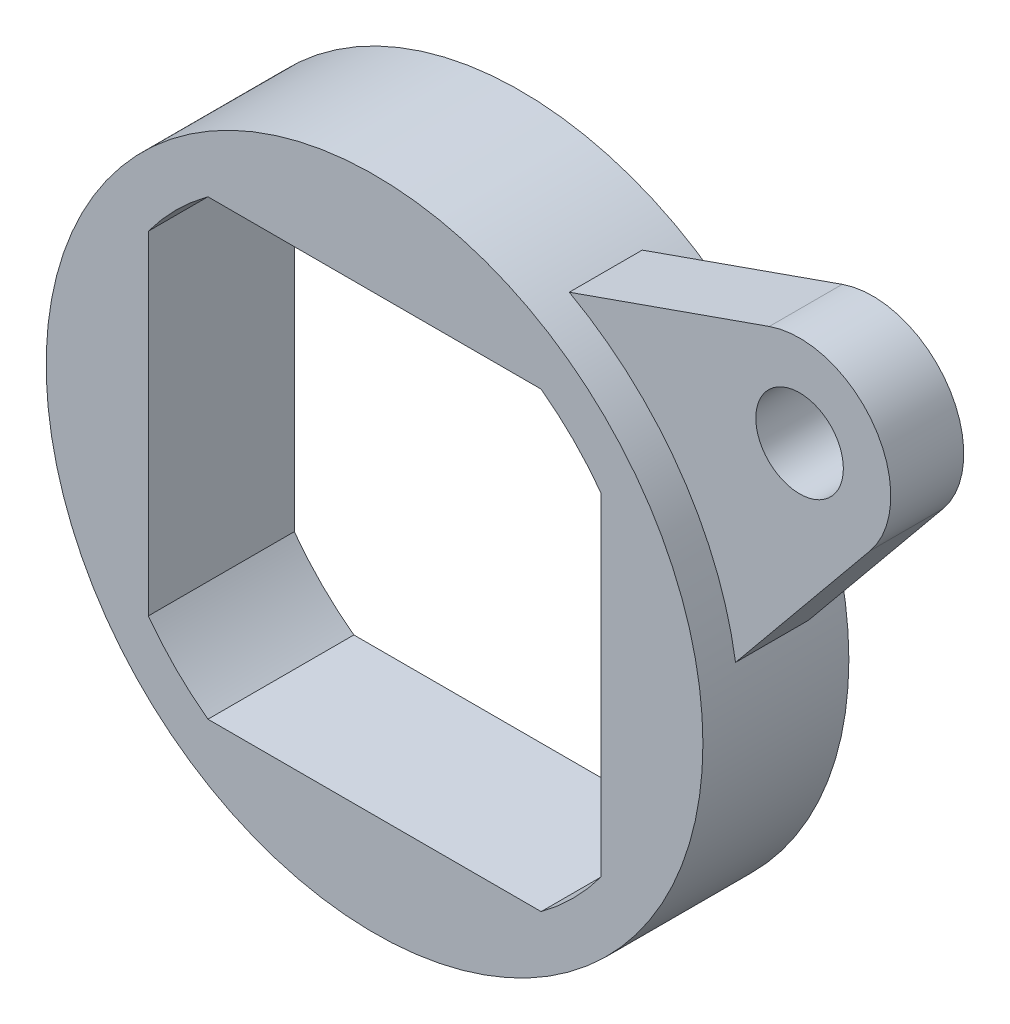
ISO-10303-21;
HEADER;
FILE_DESCRIPTION(('STEP AP214'),'2;1');
FILE_NAME('part.step','',(''),(''),'','','');
FILE_SCHEMA(('AUTOMOTIVE_DESIGN { 1 0 10303 214 1 1 1 1 }'));
ENDSEC;
DATA;
#1=APPLICATION_CONTEXT('core data for automotive mechanical design processes');
#2=APPLICATION_PROTOCOL_DEFINITION('international standard','automotive_design',2000,#1);
#3=PRODUCT_CONTEXT('',#1,'mechanical');
#4=PRODUCT('Part','Part','',(#3));
#5=PRODUCT_RELATED_PRODUCT_CATEGORY('part','',(#4));
#6=PRODUCT_DEFINITION_FORMATION('','',#4);
#7=PRODUCT_DEFINITION_CONTEXT('part definition',#1,'design');
#8=PRODUCT_DEFINITION('design','',#6,#7);
#9=PRODUCT_DEFINITION_SHAPE('','',#8);
#10=(LENGTH_UNIT() NAMED_UNIT(*) SI_UNIT(.MILLI.,.METRE.));
#11=(NAMED_UNIT(*) PLANE_ANGLE_UNIT() SI_UNIT($,.RADIAN.));
#12=(NAMED_UNIT(*) SI_UNIT($,.STERADIAN.) SOLID_ANGLE_UNIT());
#13=UNCERTAINTY_MEASURE_WITH_UNIT(LENGTH_MEASURE(1.E-05),#10,'distance_accuracy_value','');
#14=(GEOMETRIC_REPRESENTATION_CONTEXT(3) GLOBAL_UNCERTAINTY_ASSIGNED_CONTEXT((#13)) GLOBAL_UNIT_ASSIGNED_CONTEXT((#10,
#11,#12)) REPRESENTATION_CONTEXT('',''));
#15=CARTESIAN_POINT('',(0.,0.,0.));
#16=DIRECTION('',(0.,0.,1.));
#17=DIRECTION('',(1.,0.,0.));
#18=AXIS2_PLACEMENT_3D('',#15,#16,#17);
#19=CARTESIAN_POINT('',(0.,0.,24.9));
#20=DIRECTION('',(0.,0.,-1.));
#21=DIRECTION('',(-1.,0.,0.));
#22=AXIS2_PLACEMENT_3D('',#19,#20,#21);
#23=CYLINDRICAL_SURFACE('',#22,9.);
#24=DIRECTION('',(0.,0.,-1.));
#25=VECTOR('',#24,1.);
#26=CARTESIAN_POINT('',(8.8938586878365,1.37814282307574,23.9));
#27=LINE('',#26,#25);
#28=CARTESIAN_POINT('',(8.8938586878365,1.37814282307574,23.9));
#29=VERTEX_POINT('',#28);
#30=CARTESIAN_POINT('',(8.8938586878365,1.37814282307574,21.9));
#31=VERTEX_POINT('',#30);
#32=EDGE_CURVE('E58',#29,#31,#27,.T.);
#33=ORIENTED_EDGE('',*,*,#32,.F.);
#34=CARTESIAN_POINT('',(0.,0.,23.9));
#35=DIRECTION('',(0.,0.,1.));
#36=DIRECTION('',(1.,0.,0.));
#37=AXIS2_PLACEMENT_3D('',#34,#35,#36);
#38=CIRCLE('',#37,9.);
#39=CARTESIAN_POINT('',(4.33690946436556,7.88614077340092,23.9));
#40=VERTEX_POINT('',#39);
#41=EDGE_CURVE('E53',#29,#40,#38,.T.);
#42=ORIENTED_EDGE('',*,*,#41,.T.);
#43=DIRECTION('',(0.,0.,-1.));
#44=VECTOR('',#43,1.);
#45=CARTESIAN_POINT('',(4.33690946436556,7.88614077340092,23.9));
#46=LINE('',#45,#44);
#47=CARTESIAN_POINT('',(4.33690946436556,7.88614077340092,21.9));
#48=VERTEX_POINT('',#47);
#49=EDGE_CURVE('E132',#40,#48,#46,.T.);
#50=ORIENTED_EDGE('',*,*,#49,.T.);
#51=CARTESIAN_POINT('',(0.,0.,21.9));
#52=DIRECTION('',(0.,0.,1.));
#53=DIRECTION('',(1.,0.,0.));
#54=AXIS2_PLACEMENT_3D('',#51,#52,#53);
#55=CIRCLE('',#54,9.);
#56=EDGE_CURVE('E497',#31,#48,#55,.T.);
#57=ORIENTED_EDGE('',*,*,#56,.F.);
#58=EDGE_LOOP('',(#33,#42,#50,#57));
#59=FACE_BOUND('',#58,.T.);
#60=CARTESIAN_POINT('',(0.,0.,24.9));
#61=DIRECTION('',(0.,0.,1.));
#62=DIRECTION('',(1.,0.,0.));
#63=AXIS2_PLACEMENT_3D('',#60,#61,#62);
#64=CIRCLE('',#63,9.);
#65=CARTESIAN_POINT('',(9.,0.,24.9));
#66=VERTEX_POINT('',#65);
#67=EDGE_CURVE('E11',#66,#66,#64,.T.);
#68=ORIENTED_EDGE('',*,*,#67,.F.);
#69=EDGE_LOOP('',(#68));
#70=FACE_BOUND('',#69,.T.);
#71=CARTESIAN_POINT('',(0.,0.,20.9));
#72=DIRECTION('',(0.,0.,1.));
#73=DIRECTION('',(1.,0.,0.));
#74=AXIS2_PLACEMENT_3D('',#71,#72,#73);
#75=CIRCLE('',#74,9.);
#76=CARTESIAN_POINT('',(9.,0.,20.9));
#77=VERTEX_POINT('',#76);
#78=EDGE_CURVE('E42',#77,#77,#75,.T.);
#79=ORIENTED_EDGE('',*,*,#78,.T.);
#80=EDGE_LOOP('',(#79));
#81=FACE_BOUND('',#80,.T.);
#82=ADVANCED_FACE('F39',(#59,#70,#81),#23,.T.);
#83=CARTESIAN_POINT('',(0.,0.,24.9));
#84=DIRECTION('',(0.,0.,1.));
#85=DIRECTION('',(1.,0.,0.));
#86=AXIS2_PLACEMENT_3D('',#83,#84,#85);
#87=PLANE('',#86);
#88=DIRECTION('',(0.,1.,0.));
#89=VECTOR('',#88,1.);
#90=CARTESIAN_POINT('',(-6.2,-15.,24.9));
#91=LINE('',#90,#89);
#92=CARTESIAN_POINT('',(-6.2,-4.56618002273235,24.9));
#93=VERTEX_POINT('',#92);
#94=CARTESIAN_POINT('',(-6.2,4.56618002273235,24.9));
#95=VERTEX_POINT('',#94);
#96=EDGE_CURVE('E154',#93,#95,#91,.T.);
#97=ORIENTED_EDGE('',*,*,#96,.T.);
#98=CARTESIAN_POINT('',(0.,0.,24.9));
#99=DIRECTION('',(0.,0.,1.));
#100=DIRECTION('',(1.,0.,0.));
#101=AXIS2_PLACEMENT_3D('',#98,#99,#100);
#102=CIRCLE('',#101,7.7);
#103=CARTESIAN_POINT('',(-4.56618002273235,6.2,24.9));
#104=VERTEX_POINT('',#103);
#105=EDGE_CURVE('E157',#104,#95,#102,.T.);
#106=ORIENTED_EDGE('',*,*,#105,.F.);
#107=DIRECTION('',(-1.,0.,0.));
#108=VECTOR('',#107,1.);
#109=CARTESIAN_POINT('',(-11.07277942026,6.2,24.9));
#110=LINE('',#109,#108);
#111=CARTESIAN_POINT('',(4.56618002273235,6.2,24.9));
#112=VERTEX_POINT('',#111);
#113=EDGE_CURVE('E160',#112,#104,#110,.T.);
#114=ORIENTED_EDGE('',*,*,#113,.F.);
#115=CARTESIAN_POINT('',(0.,0.,24.9));
#116=DIRECTION('',(0.,0.,1.));
#117=DIRECTION('',(1.,0.,0.));
#118=AXIS2_PLACEMENT_3D('',#115,#116,#117);
#119=CIRCLE('',#118,7.7);
#120=CARTESIAN_POINT('',(6.2,4.56618002273235,24.9));
#121=VERTEX_POINT('',#120);
#122=EDGE_CURVE('E163',#121,#112,#119,.T.);
#123=ORIENTED_EDGE('',*,*,#122,.F.);
#124=DIRECTION('',(0.,1.,0.));
#125=VECTOR('',#124,1.);
#126=CARTESIAN_POINT('',(6.2,-15.,24.9));
#127=LINE('',#126,#125);
#128=CARTESIAN_POINT('',(6.2,-4.56618002273235,24.9));
#129=VERTEX_POINT('',#128);
#130=EDGE_CURVE('E165',#129,#121,#127,.T.);
#131=ORIENTED_EDGE('',*,*,#130,.F.);
#132=CARTESIAN_POINT('',(0.,0.,24.9));
#133=DIRECTION('',(0.,0.,1.));
#134=DIRECTION('',(1.,0.,0.));
#135=AXIS2_PLACEMENT_3D('',#132,#133,#134);
#136=CIRCLE('',#135,7.7);
#137=CARTESIAN_POINT('',(4.56618002273235,-6.2,24.9));
#138=VERTEX_POINT('',#137);
#139=EDGE_CURVE('E167',#138,#129,#136,.T.);
#140=ORIENTED_EDGE('',*,*,#139,.F.);
#141=DIRECTION('',(-1.,0.,0.));
#142=VECTOR('',#141,1.);
#143=CARTESIAN_POINT('',(-11.07277942026,-6.2,24.9));
#144=LINE('',#143,#142);
#145=CARTESIAN_POINT('',(-4.56618002273236,-6.2,24.9));
#146=VERTEX_POINT('',#145);
#147=EDGE_CURVE('E169',#138,#146,#144,.T.);
#148=ORIENTED_EDGE('',*,*,#147,.T.);
#149=CARTESIAN_POINT('',(0.,0.,24.9));
#150=DIRECTION('',(0.,0.,1.));
#151=DIRECTION('',(1.,0.,0.));
#152=AXIS2_PLACEMENT_3D('',#149,#150,#151);
#153=CIRCLE('',#152,7.7);
#154=EDGE_CURVE('E172',#93,#146,#153,.T.);
#155=ORIENTED_EDGE('',*,*,#154,.F.);
#156=EDGE_LOOP('',(#97,#106,#114,#123,#131,#140,#148,#155));
#157=FACE_BOUND('',#156,.T.);
#158=ORIENTED_EDGE('',*,*,#67,.T.);
#159=EDGE_LOOP('',(#158));
#160=FACE_BOUND('',#159,.T.);
#161=ADVANCED_FACE('F228',(#157,#160),#87,.T.);
#162=CARTESIAN_POINT('',(0.,0.,20.9));
#163=DIRECTION('',(0.,0.,1.));
#164=DIRECTION('',(1.,0.,0.));
#165=AXIS2_PLACEMENT_3D('',#162,#163,#164);
#166=PLANE('',#165);
#167=CARTESIAN_POINT('',(0.,0.,20.9));
#168=DIRECTION('',(0.,0.,1.));
#169=DIRECTION('',(1.,0.,0.));
#170=AXIS2_PLACEMENT_3D('',#167,#168,#169);
#171=CIRCLE('',#170,7.7);
#172=CARTESIAN_POINT('',(-4.56618002273235,6.2,20.9));
#173=VERTEX_POINT('',#172);
#174=CARTESIAN_POINT('',(-6.2,4.56618002273235,20.9));
#175=VERTEX_POINT('',#174);
#176=EDGE_CURVE('E149',#173,#175,#171,.T.);
#177=ORIENTED_EDGE('',*,*,#176,.T.);
#178=DIRECTION('',(0.,1.,0.));
#179=VECTOR('',#178,1.);
#180=CARTESIAN_POINT('',(-6.2,-15.,20.9));
#181=LINE('',#180,#179);
#182=CARTESIAN_POINT('',(-6.2,-4.56618002273235,20.9));
#183=VERTEX_POINT('',#182);
#184=EDGE_CURVE('E147',#183,#175,#181,.T.);
#185=ORIENTED_EDGE('',*,*,#184,.F.);
#186=CARTESIAN_POINT('',(0.,0.,20.9));
#187=DIRECTION('',(0.,0.,1.));
#188=DIRECTION('',(1.,0.,0.));
#189=AXIS2_PLACEMENT_3D('',#186,#187,#188);
#190=CIRCLE('',#189,7.7);
#191=CARTESIAN_POINT('',(-4.56618002273236,-6.2,20.9));
#192=VERTEX_POINT('',#191);
#193=EDGE_CURVE('E158',#183,#192,#190,.T.);
#194=ORIENTED_EDGE('',*,*,#193,.T.);
#195=DIRECTION('',(-1.,0.,0.));
#196=VECTOR('',#195,1.);
#197=CARTESIAN_POINT('',(-11.07277942026,-6.2,20.9));
#198=LINE('',#197,#196);
#199=CARTESIAN_POINT('',(4.56618002273235,-6.2,20.9));
#200=VERTEX_POINT('',#199);
#201=EDGE_CURVE('E189',#200,#192,#198,.T.);
#202=ORIENTED_EDGE('',*,*,#201,.F.);
#203=CARTESIAN_POINT('',(0.,0.,20.9));
#204=DIRECTION('',(0.,0.,1.));
#205=DIRECTION('',(1.,0.,0.));
#206=AXIS2_PLACEMENT_3D('',#203,#204,#205);
#207=CIRCLE('',#206,7.7);
#208=CARTESIAN_POINT('',(6.2,-4.56618002273235,20.9));
#209=VERTEX_POINT('',#208);
#210=EDGE_CURVE('E186',#200,#209,#207,.T.);
#211=ORIENTED_EDGE('',*,*,#210,.T.);
#212=DIRECTION('',(0.,1.,0.));
#213=VECTOR('',#212,1.);
#214=CARTESIAN_POINT('',(6.2,-15.,20.9));
#215=LINE('',#214,#213);
#216=CARTESIAN_POINT('',(6.2,4.56618002273235,20.9));
#217=VERTEX_POINT('',#216);
#218=EDGE_CURVE('E183',#209,#217,#215,.T.);
#219=ORIENTED_EDGE('',*,*,#218,.T.);
#220=CARTESIAN_POINT('',(0.,0.,20.9));
#221=DIRECTION('',(0.,0.,1.));
#222=DIRECTION('',(1.,0.,0.));
#223=AXIS2_PLACEMENT_3D('',#220,#221,#222);
#224=CIRCLE('',#223,7.7);
#225=CARTESIAN_POINT('',(4.56618002273235,6.2,20.9));
#226=VERTEX_POINT('',#225);
#227=EDGE_CURVE('E180',#217,#226,#224,.T.);
#228=ORIENTED_EDGE('',*,*,#227,.T.);
#229=DIRECTION('',(-1.,0.,0.));
#230=VECTOR('',#229,1.);
#231=CARTESIAN_POINT('',(-11.07277942026,6.2,20.9));
#232=LINE('',#231,#230);
#233=EDGE_CURVE('E177',#226,#173,#232,.T.);
#234=ORIENTED_EDGE('',*,*,#233,.T.);
#235=EDGE_LOOP('',(#177,#185,#194,#202,#211,#219,#228,#234));
#236=FACE_BOUND('',#235,.T.);
#237=ORIENTED_EDGE('',*,*,#78,.F.);
#238=EDGE_LOOP('',(#237));
#239=FACE_BOUND('',#238,.T.);
#240=ADVANCED_FACE('F218',(#236,#239),#166,.F.);
#241=CARTESIAN_POINT('',(-6.2,-15.,24.9));
#242=DIRECTION('',(-1.,0.,0.));
#243=DIRECTION('',(0.,0.,1.));
#244=AXIS2_PLACEMENT_3D('',#241,#242,#243);
#245=PLANE('',#244);
#246=ORIENTED_EDGE('',*,*,#184,.T.);
#247=DIRECTION('',(0.,0.,-1.));
#248=VECTOR('',#247,1.);
#249=CARTESIAN_POINT('',(-6.2,4.56618002273235,24.9));
#250=LINE('',#249,#248);
#251=EDGE_CURVE('E173',#95,#175,#250,.T.);
#252=ORIENTED_EDGE('',*,*,#251,.F.);
#253=ORIENTED_EDGE('',*,*,#96,.F.);
#254=DIRECTION('',(0.,0.,-1.));
#255=VECTOR('',#254,1.);
#256=CARTESIAN_POINT('',(-6.2,-4.56618002273235,24.9));
#257=LINE('',#256,#255);
#258=EDGE_CURVE('E194',#93,#183,#257,.T.);
#259=ORIENTED_EDGE('',*,*,#258,.T.);
#260=EDGE_LOOP('',(#246,#252,#253,#259));
#261=FACE_BOUND('',#260,.T.);
#262=ADVANCED_FACE('F231',(#261),#245,.F.);
#263=CARTESIAN_POINT('',(0.,0.,24.9));
#264=DIRECTION('',(0.,0.,-1.));
#265=DIRECTION('',(-1.,0.,0.));
#266=AXIS2_PLACEMENT_3D('',#263,#264,#265);
#267=CYLINDRICAL_SURFACE('',#266,7.7);
#268=ORIENTED_EDGE('',*,*,#193,.F.);
#269=ORIENTED_EDGE('',*,*,#258,.F.);
#270=ORIENTED_EDGE('',*,*,#154,.T.);
#271=DIRECTION('',(0.,0.,-1.));
#272=VECTOR('',#271,1.);
#273=CARTESIAN_POINT('',(-4.56618002273236,-6.2,24.9));
#274=LINE('',#273,#272);
#275=EDGE_CURVE('E196',#146,#192,#274,.T.);
#276=ORIENTED_EDGE('',*,*,#275,.T.);
#277=EDGE_LOOP('',(#268,#269,#270,#276));
#278=FACE_BOUND('',#277,.T.);
#279=ADVANCED_FACE('F234',(#278),#267,.F.);
#280=CARTESIAN_POINT('',(-11.07277942026,-6.2,24.9));
#281=DIRECTION('',(0.,-1.,0.));
#282=DIRECTION('',(0.,0.,-1.));
#283=AXIS2_PLACEMENT_3D('',#280,#281,#282);
#284=PLANE('',#283);
#285=ORIENTED_EDGE('',*,*,#201,.T.);
#286=ORIENTED_EDGE('',*,*,#275,.F.);
#287=ORIENTED_EDGE('',*,*,#147,.F.);
#288=DIRECTION('',(0.,0.,-1.));
#289=VECTOR('',#288,1.);
#290=CARTESIAN_POINT('',(4.56618002273235,-6.2,24.9));
#291=LINE('',#290,#289);
#292=EDGE_CURVE('E198',#138,#200,#291,.T.);
#293=ORIENTED_EDGE('',*,*,#292,.T.);
#294=EDGE_LOOP('',(#285,#286,#287,#293));
#295=FACE_BOUND('',#294,.T.);
#296=ADVANCED_FACE('F239',(#295),#284,.F.);
#297=CARTESIAN_POINT('',(0.,0.,24.9));
#298=DIRECTION('',(0.,0.,-1.));
#299=DIRECTION('',(-1.,0.,0.));
#300=AXIS2_PLACEMENT_3D('',#297,#298,#299);
#301=CYLINDRICAL_SURFACE('',#300,7.7);
#302=ORIENTED_EDGE('',*,*,#210,.F.);
#303=ORIENTED_EDGE('',*,*,#292,.F.);
#304=ORIENTED_EDGE('',*,*,#139,.T.);
#305=DIRECTION('',(0.,0.,-1.));
#306=VECTOR('',#305,1.);
#307=CARTESIAN_POINT('',(6.2,-4.56618002273235,24.9));
#308=LINE('',#307,#306);
#309=EDGE_CURVE('E200',#129,#209,#308,.T.);
#310=ORIENTED_EDGE('',*,*,#309,.T.);
#311=EDGE_LOOP('',(#302,#303,#304,#310));
#312=FACE_BOUND('',#311,.T.);
#313=ADVANCED_FACE('F243',(#312),#301,.F.);
#314=CARTESIAN_POINT('',(6.2,-15.,24.9));
#315=DIRECTION('',(-1.,0.,0.));
#316=DIRECTION('',(0.,0.,1.));
#317=AXIS2_PLACEMENT_3D('',#314,#315,#316);
#318=PLANE('',#317);
#319=ORIENTED_EDGE('',*,*,#218,.F.);
#320=ORIENTED_EDGE('',*,*,#309,.F.);
#321=ORIENTED_EDGE('',*,*,#130,.T.);
#322=DIRECTION('',(0.,0.,-1.));
#323=VECTOR('',#322,1.);
#324=CARTESIAN_POINT('',(6.2,4.56618002273235,24.9));
#325=LINE('',#324,#323);
#326=EDGE_CURVE('E202',#121,#217,#325,.T.);
#327=ORIENTED_EDGE('',*,*,#326,.T.);
#328=EDGE_LOOP('',(#319,#320,#321,#327));
#329=FACE_BOUND('',#328,.T.);
#330=ADVANCED_FACE('F248',(#329),#318,.T.);
#331=CARTESIAN_POINT('',(0.,0.,24.9));
#332=DIRECTION('',(0.,0.,-1.));
#333=DIRECTION('',(-1.,0.,0.));
#334=AXIS2_PLACEMENT_3D('',#331,#332,#333);
#335=CYLINDRICAL_SURFACE('',#334,7.7);
#336=ORIENTED_EDGE('',*,*,#227,.F.);
#337=ORIENTED_EDGE('',*,*,#326,.F.);
#338=ORIENTED_EDGE('',*,*,#122,.T.);
#339=DIRECTION('',(0.,0.,-1.));
#340=VECTOR('',#339,1.);
#341=CARTESIAN_POINT('',(4.56618002273235,6.2,24.9));
#342=LINE('',#341,#340);
#343=EDGE_CURVE('E204',#112,#226,#342,.T.);
#344=ORIENTED_EDGE('',*,*,#343,.T.);
#345=EDGE_LOOP('',(#336,#337,#338,#344));
#346=FACE_BOUND('',#345,.T.);
#347=ADVANCED_FACE('F251',(#346),#335,.F.);
#348=CARTESIAN_POINT('',(-11.07277942026,6.2,24.9));
#349=DIRECTION('',(0.,-1.,0.));
#350=DIRECTION('',(0.,0.,-1.));
#351=AXIS2_PLACEMENT_3D('',#348,#349,#350);
#352=PLANE('',#351);
#353=ORIENTED_EDGE('',*,*,#233,.F.);
#354=ORIENTED_EDGE('',*,*,#343,.F.);
#355=ORIENTED_EDGE('',*,*,#113,.T.);
#356=DIRECTION('',(0.,0.,-1.));
#357=VECTOR('',#356,1.);
#358=CARTESIAN_POINT('',(-4.56618002273235,6.2,24.9));
#359=LINE('',#358,#357);
#360=EDGE_CURVE('E206',#104,#173,#359,.T.);
#361=ORIENTED_EDGE('',*,*,#360,.T.);
#362=EDGE_LOOP('',(#353,#354,#355,#361));
#363=FACE_BOUND('',#362,.T.);
#364=ADVANCED_FACE('F224',(#363),#352,.T.);
#365=CARTESIAN_POINT('',(0.,0.,24.9));
#366=DIRECTION('',(0.,0.,-1.));
#367=DIRECTION('',(-1.,0.,0.));
#368=AXIS2_PLACEMENT_3D('',#365,#366,#367);
#369=CYLINDRICAL_SURFACE('',#368,7.7);
#370=ORIENTED_EDGE('',*,*,#176,.F.);
#371=ORIENTED_EDGE('',*,*,#360,.F.);
#372=ORIENTED_EDGE('',*,*,#105,.T.);
#373=ORIENTED_EDGE('',*,*,#251,.T.);
#374=EDGE_LOOP('',(#370,#371,#372,#373));
#375=FACE_BOUND('',#374,.T.);
#376=ADVANCED_FACE('F212',(#375),#369,.F.);
#377=CARTESIAN_POINT('',(10.648976575757,7.4564936725635,23.9));
#378=DIRECTION('',(0.,0.,-1.));
#379=DIRECTION('',(-1.,0.,0.));
#380=AXIS2_PLACEMENT_3D('',#377,#378,#379);
#381=CYLINDRICAL_SURFACE('',#380,2.5);
#382=CARTESIAN_POINT('',(10.648976575757,7.4564936725635,21.9));
#383=DIRECTION('',(0.,0.,1.));
#384=DIRECTION('',(1.,0.,0.));
#385=AXIS2_PLACEMENT_3D('',#382,#383,#384);
#386=CIRCLE('',#385,2.5);
#387=CARTESIAN_POINT('',(12.5813227249027,5.87029117607016,21.9));
#388=VERTEX_POINT('',#387);
#389=CARTESIAN_POINT('',(9.81933510161566,9.814818294914,21.9));
#390=VERTEX_POINT('',#389);
#391=EDGE_CURVE('E146',#388,#390,#386,.T.);
#392=ORIENTED_EDGE('',*,*,#391,.T.);
#393=DIRECTION('',(0.,0.,-1.));
#394=VECTOR('',#393,1.);
#395=CARTESIAN_POINT('',(9.81933510161566,9.814818294914,23.9));
#396=LINE('',#395,#394);
#397=CARTESIAN_POINT('',(9.81933510161566,9.814818294914,23.9));
#398=VERTEX_POINT('',#397);
#399=EDGE_CURVE('E130',#398,#390,#396,.T.);
#400=ORIENTED_EDGE('',*,*,#399,.F.);
#401=CARTESIAN_POINT('',(10.648976575757,7.4564936725635,23.9));
#402=DIRECTION('',(0.,0.,1.));
#403=DIRECTION('',(1.,0.,0.));
#404=AXIS2_PLACEMENT_3D('',#401,#402,#403);
#405=CIRCLE('',#404,2.5);
#406=CARTESIAN_POINT('',(12.5813227249027,5.87029117607016,23.9));
#407=VERTEX_POINT('',#406);
#408=EDGE_CURVE('E134',#407,#398,#405,.T.);
#409=ORIENTED_EDGE('',*,*,#408,.F.);
#410=DIRECTION('',(0.,0.,-1.));
#411=VECTOR('',#410,1.);
#412=CARTESIAN_POINT('',(12.5813227249027,5.87029117607016,23.9));
#413=LINE('',#412,#411);
#414=EDGE_CURVE('E496',#407,#388,#413,.T.);
#415=ORIENTED_EDGE('',*,*,#414,.T.);
#416=EDGE_LOOP('',(#392,#400,#409,#415));
#417=FACE_BOUND('',#416,.T.);
#418=ADVANCED_FACE('F144',(#417),#381,.T.);
#419=CARTESIAN_POINT('',(-1.99113953793913,5.65997909364121,23.9));
#420=DIRECTION('',(0.331856589656522,-0.943329848940201,0.));
#421=DIRECTION('',(0.943329848940201,0.331856589656522,0.));
#422=AXIS2_PLACEMENT_3D('',#419,#420,#421);
#423=PLANE('',#422);
#424=DIRECTION('',(-0.943329848940201,-0.331856589656522,0.));
#425=VECTOR('',#424,1.);
#426=CARTESIAN_POINT('',(-1.99113953793913,5.65997909364121,21.9));
#427=LINE('',#426,#425);
#428=EDGE_CURVE('E494',#390,#48,#427,.T.);
#429=ORIENTED_EDGE('',*,*,#428,.T.);
#430=ORIENTED_EDGE('',*,*,#49,.F.);
#431=DIRECTION('',(-0.943329848940201,-0.331856589656522,0.));
#432=VECTOR('',#431,1.);
#433=CARTESIAN_POINT('',(-1.99113953793913,5.65997909364121,23.9));
#434=LINE('',#433,#432);
#435=EDGE_CURVE('E125',#398,#40,#434,.T.);
#436=ORIENTED_EDGE('',*,*,#435,.F.);
#437=ORIENTED_EDGE('',*,*,#399,.T.);
#438=EDGE_LOOP('',(#429,#430,#436,#437));
#439=FACE_BOUND('',#438,.T.);
#440=ADVANCED_FACE('F128',(#439),#423,.F.);
#441=CARTESIAN_POINT('',(10.648976575757,7.4564936725635,23.9));
#442=DIRECTION('',(0.,0.,-1.));
#443=DIRECTION('',(-1.,0.,0.));
#444=AXIS2_PLACEMENT_3D('',#441,#442,#443);
#445=CYLINDRICAL_SURFACE('',#444,1.2);
#446=CARTESIAN_POINT('',(10.648976575757,7.4564936725635,23.9));
#447=DIRECTION('',(0.,0.,1.));
#448=DIRECTION('',(1.,0.,0.));
#449=AXIS2_PLACEMENT_3D('',#446,#447,#448);
#450=CIRCLE('',#449,1.2);
#451=CARTESIAN_POINT('',(11.848976575757,7.4564936725635,23.9));
#452=VERTEX_POINT('',#451);
#453=EDGE_CURVE('E142',#452,#452,#450,.T.);
#454=ORIENTED_EDGE('',*,*,#453,.T.);
#455=EDGE_LOOP('',(#454));
#456=FACE_BOUND('',#455,.T.);
#457=CARTESIAN_POINT('',(10.648976575757,7.4564936725635,21.9));
#458=DIRECTION('',(0.,0.,1.));
#459=DIRECTION('',(1.,0.,0.));
#460=AXIS2_PLACEMENT_3D('',#457,#458,#459);
#461=CIRCLE('',#460,1.2);
#462=CARTESIAN_POINT('',(11.848976575757,7.4564936725635,21.9));
#463=VERTEX_POINT('',#462);
#464=EDGE_CURVE('E489',#463,#463,#461,.T.);
#465=ORIENTED_EDGE('',*,*,#464,.F.);
#466=EDGE_LOOP('',(#465));
#467=FACE_BOUND('',#466,.T.);
#468=ADVANCED_FACE('F284',(#456,#467),#445,.F.);
#469=CARTESIAN_POINT('',(4.63763075794974,-3.80688599158401,23.9));
#470=DIRECTION('',(0.772938459658289,-0.634480998597335,0.));
#471=DIRECTION('',(0.634480998597335,0.772938459658289,0.));
#472=AXIS2_PLACEMENT_3D('',#469,#470,#471);
#473=PLANE('',#472);
#474=DIRECTION('',(-0.634480998597335,-0.772938459658289,0.));
#475=VECTOR('',#474,1.);
#476=CARTESIAN_POINT('',(4.63763075794974,-3.80688599158401,21.9));
#477=LINE('',#476,#475);
#478=EDGE_CURVE('E493',#388,#31,#477,.T.);
#479=ORIENTED_EDGE('',*,*,#478,.F.);
#480=ORIENTED_EDGE('',*,*,#414,.F.);
#481=DIRECTION('',(-0.634480998597335,-0.772938459658289,0.));
#482=VECTOR('',#481,1.);
#483=CARTESIAN_POINT('',(4.63763075794974,-3.80688599158401,23.9));
#484=LINE('',#483,#482);
#485=EDGE_CURVE('E140',#407,#29,#484,.T.);
#486=ORIENTED_EDGE('',*,*,#485,.T.);
#487=ORIENTED_EDGE('',*,*,#32,.T.);
#488=EDGE_LOOP('',(#479,#480,#486,#487));
#489=FACE_BOUND('',#488,.T.);
#490=ADVANCED_FACE('F290',(#489),#473,.T.);
#491=CARTESIAN_POINT('',(0.,0.,23.9));
#492=DIRECTION('',(0.,0.,1.));
#493=DIRECTION('',(1.,0.,0.));
#494=AXIS2_PLACEMENT_3D('',#491,#492,#493);
#495=PLANE('',#494);
#496=ORIENTED_EDGE('',*,*,#453,.F.);
#497=EDGE_LOOP('',(#496));
#498=FACE_BOUND('',#497,.T.);
#499=ORIENTED_EDGE('',*,*,#408,.T.);
#500=ORIENTED_EDGE('',*,*,#435,.T.);
#501=ORIENTED_EDGE('',*,*,#41,.F.);
#502=ORIENTED_EDGE('',*,*,#485,.F.);
#503=EDGE_LOOP('',(#499,#500,#501,#502));
#504=FACE_BOUND('',#503,.T.);
#505=ADVANCED_FACE('F138',(#498,#504),#495,.T.);
#506=CARTESIAN_POINT('',(0.,0.,21.9));
#507=DIRECTION('',(0.,0.,1.));
#508=DIRECTION('',(1.,0.,0.));
#509=AXIS2_PLACEMENT_3D('',#506,#507,#508);
#510=PLANE('',#509);
#511=ORIENTED_EDGE('',*,*,#464,.T.);
#512=EDGE_LOOP('',(#511));
#513=FACE_BOUND('',#512,.T.);
#514=ORIENTED_EDGE('',*,*,#391,.F.);
#515=ORIENTED_EDGE('',*,*,#478,.T.);
#516=ORIENTED_EDGE('',*,*,#56,.T.);
#517=ORIENTED_EDGE('',*,*,#428,.F.);
#518=EDGE_LOOP('',(#514,#515,#516,#517));
#519=FACE_BOUND('',#518,.T.);
#520=ADVANCED_FACE('F365',(#513,#519),#510,.F.);
#521=CLOSED_SHELL('',(#82,#161,#240,#262,#279,#296,#313,#330,#347,#364,#376,#418,#440,#468,#490,
#505,#520));
#522=MANIFOLD_SOLID_BREP('B2',#521);
#523=ADVANCED_BREP_SHAPE_REPRESENTATION('',(#18,#522),#14);
#524=SHAPE_DEFINITION_REPRESENTATION(#9,#523);
ENDSEC;
END-ISO-10303-21;
